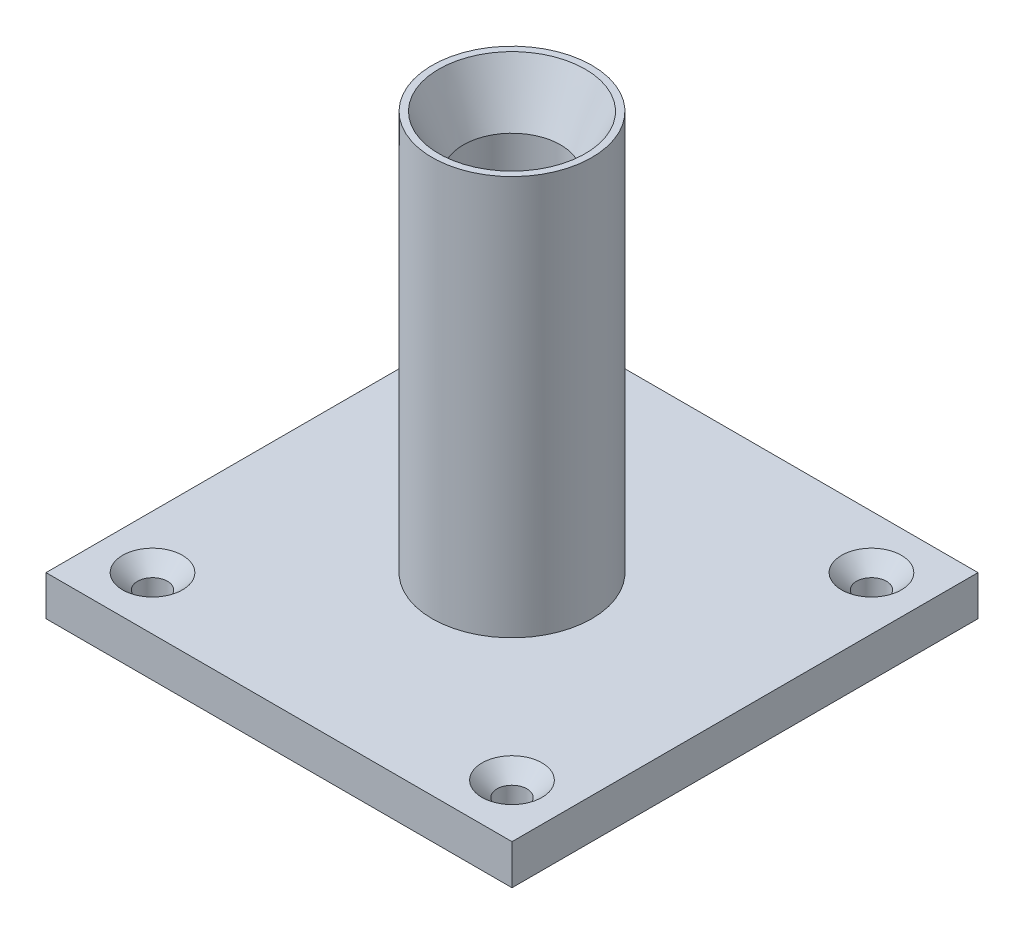
ISO-10303-21;
HEADER;
FILE_DESCRIPTION(('STEP AP214'),'2;1');
FILE_NAME('part.step','',(''),(''),'','','');
FILE_SCHEMA(('AUTOMOTIVE_DESIGN { 1 0 10303 214 1 1 1 1 }'));
ENDSEC;
DATA;
#1=APPLICATION_CONTEXT('core data for automotive mechanical design processes');
#2=APPLICATION_PROTOCOL_DEFINITION('international standard','automotive_design',2000,#1);
#3=PRODUCT_CONTEXT('',#1,'mechanical');
#4=PRODUCT('Part','Part','',(#3));
#5=PRODUCT_RELATED_PRODUCT_CATEGORY('part','',(#4));
#6=PRODUCT_DEFINITION_FORMATION('','',#4);
#7=PRODUCT_DEFINITION_CONTEXT('part definition',#1,'design');
#8=PRODUCT_DEFINITION('design','',#6,#7);
#9=PRODUCT_DEFINITION_SHAPE('','',#8);
#10=(LENGTH_UNIT() NAMED_UNIT(*) SI_UNIT(.MILLI.,.METRE.));
#11=(NAMED_UNIT(*) PLANE_ANGLE_UNIT() SI_UNIT($,.RADIAN.));
#12=(NAMED_UNIT(*) SI_UNIT($,.STERADIAN.) SOLID_ANGLE_UNIT());
#13=UNCERTAINTY_MEASURE_WITH_UNIT(LENGTH_MEASURE(1.E-05),#10,'distance_accuracy_value','');
#14=(GEOMETRIC_REPRESENTATION_CONTEXT(3) GLOBAL_UNCERTAINTY_ASSIGNED_CONTEXT((#13)) GLOBAL_UNIT_ASSIGNED_CONTEXT((#10,
#11,#12)) REPRESENTATION_CONTEXT('',''));
#15=CARTESIAN_POINT('',(0.,0.,0.));
#16=DIRECTION('',(0.,0.,1.));
#17=DIRECTION('',(1.,0.,0.));
#18=AXIS2_PLACEMENT_3D('',#15,#16,#17);
#19=CARTESIAN_POINT('',(0.,0.,0.));
#20=DIRECTION('',(0.,-1.,0.));
#21=DIRECTION('',(0.,0.,-1.));
#22=AXIS2_PLACEMENT_3D('',#19,#20,#21);
#23=CYLINDRICAL_SURFACE('',#22,7.3);
#24=CARTESIAN_POINT('',(0.,58.,0.));
#25=DIRECTION('',(0.,-1.,0.));
#26=DIRECTION('',(0.,0.,-1.));
#27=AXIS2_PLACEMENT_3D('',#24,#25,#26);
#28=CIRCLE('',#27,7.3);
#29=CARTESIAN_POINT('',(6.3,58.,3.68781778291716));
#30=VERTEX_POINT('',#29);
#31=CARTESIAN_POINT('',(6.3,58.,-3.68781778291716));
#32=VERTEX_POINT('',#31);
#33=EDGE_CURVE('E114',#30,#32,#28,.T.);
#34=ORIENTED_EDGE('',*,*,#33,.F.);
#35=DIRECTION('',(0.,-1.,0.));
#36=VECTOR('',#35,1.);
#37=CARTESIAN_POINT('',(6.3,58.,3.68781778291716));
#38=LINE('',#37,#36);
#39=CARTESIAN_POINT('',(6.3,6.,3.68781778291716));
#40=VERTEX_POINT('',#39);
#41=EDGE_CURVE('E103',#30,#40,#38,.T.);
#42=ORIENTED_EDGE('',*,*,#41,.T.);
#43=CARTESIAN_POINT('',(0.,6.,0.));
#44=DIRECTION('',(0.,1.,0.));
#45=DIRECTION('',(0.,0.,1.));
#46=AXIS2_PLACEMENT_3D('',#43,#44,#45);
#47=CIRCLE('',#46,7.3);
#48=CARTESIAN_POINT('',(6.3,6.,-3.68781778291715));
#49=VERTEX_POINT('',#48);
#50=EDGE_CURVE('E119',#40,#49,#47,.F.);
#51=ORIENTED_EDGE('',*,*,#50,.T.);
#52=DIRECTION('',(0.,-1.,0.));
#53=VECTOR('',#52,1.);
#54=CARTESIAN_POINT('',(6.3,58.,-3.68781778291716));
#55=LINE('',#54,#53);
#56=EDGE_CURVE('E53',#32,#49,#55,.T.);
#57=ORIENTED_EDGE('',*,*,#56,.F.);
#58=EDGE_LOOP('',(#34,#42,#51,#57));
#59=FACE_BOUND('',#58,.T.);
#60=ADVANCED_FACE('F37',(#59),#23,.F.);
#61=CARTESIAN_POINT('',(0.,6.,0.));
#62=DIRECTION('',(0.,1.,0.));
#63=DIRECTION('',(0.,0.,1.));
#64=AXIS2_PLACEMENT_3D('',#61,#62,#63);
#65=PLANE('',#64);
#66=ORIENTED_EDGE('',*,*,#50,.F.);
#67=DIRECTION('',(0.,0.,1.));
#68=VECTOR('',#67,1.);
#69=CARTESIAN_POINT('',(6.3,6.,3.68781778291716));
#70=LINE('',#69,#68);
#71=EDGE_CURVE('E106',#49,#40,#70,.T.);
#72=ORIENTED_EDGE('',*,*,#71,.F.);
#73=EDGE_LOOP('',(#66,#72));
#74=FACE_BOUND('',#73,.T.);
#75=ADVANCED_FACE('F193',(#74),#65,.T.);
#76=CARTESIAN_POINT('',(-35.,6.,-35.));
#77=DIRECTION('',(1.,0.,0.));
#78=DIRECTION('',(0.,0.,-1.));
#79=AXIS2_PLACEMENT_3D('',#76,#77,#78);
#80=PLANE('',#79);
#81=DIRECTION('',(0.,0.,1.));
#82=VECTOR('',#81,1.);
#83=CARTESIAN_POINT('',(-35.,0.,-35.));
#84=LINE('',#83,#82);
#85=CARTESIAN_POINT('',(-35.,0.,-35.));
#86=VERTEX_POINT('',#85);
#87=CARTESIAN_POINT('',(-35.,0.,35.));
#88=VERTEX_POINT('',#87);
#89=EDGE_CURVE('E130',#86,#88,#84,.T.);
#90=ORIENTED_EDGE('',*,*,#89,.T.);
#91=DIRECTION('',(0.,-1.,0.));
#92=VECTOR('',#91,1.);
#93=CARTESIAN_POINT('',(-35.,6.,35.));
#94=LINE('',#93,#92);
#95=CARTESIAN_POINT('',(-35.,6.,35.));
#96=VERTEX_POINT('',#95);
#97=EDGE_CURVE('E151',#96,#88,#94,.T.);
#98=ORIENTED_EDGE('',*,*,#97,.F.);
#99=DIRECTION('',(0.,0.,1.));
#100=VECTOR('',#99,1.);
#101=CARTESIAN_POINT('',(-35.,6.,-35.));
#102=LINE('',#101,#100);
#103=CARTESIAN_POINT('',(-35.,6.,-35.));
#104=VERTEX_POINT('',#103);
#105=EDGE_CURVE('E131',#104,#96,#102,.T.);
#106=ORIENTED_EDGE('',*,*,#105,.F.);
#107=DIRECTION('',(0.,-1.,0.));
#108=VECTOR('',#107,1.);
#109=CARTESIAN_POINT('',(-35.,6.,-35.));
#110=LINE('',#109,#108);
#111=EDGE_CURVE('E137',#104,#86,#110,.T.);
#112=ORIENTED_EDGE('',*,*,#111,.T.);
#113=EDGE_LOOP('',(#90,#98,#106,#112));
#114=FACE_BOUND('',#113,.T.);
#115=ADVANCED_FACE('F200',(#114),#80,.F.);
#116=CARTESIAN_POINT('',(-35.,6.,35.));
#117=DIRECTION('',(0.,0.,-1.));
#118=DIRECTION('',(-1.,0.,0.));
#119=AXIS2_PLACEMENT_3D('',#116,#117,#118);
#120=PLANE('',#119);
#121=DIRECTION('',(1.,0.,0.));
#122=VECTOR('',#121,1.);
#123=CARTESIAN_POINT('',(-35.,0.,35.));
#124=LINE('',#123,#122);
#125=CARTESIAN_POINT('',(35.,0.,35.));
#126=VERTEX_POINT('',#125);
#127=EDGE_CURVE('E140',#88,#126,#124,.T.);
#128=ORIENTED_EDGE('',*,*,#127,.T.);
#129=DIRECTION('',(0.,-1.,0.));
#130=VECTOR('',#129,1.);
#131=CARTESIAN_POINT('',(35.,6.,35.));
#132=LINE('',#131,#130);
#133=CARTESIAN_POINT('',(35.,6.,35.));
#134=VERTEX_POINT('',#133);
#135=EDGE_CURVE('E148',#134,#126,#132,.T.);
#136=ORIENTED_EDGE('',*,*,#135,.F.);
#137=DIRECTION('',(1.,0.,0.));
#138=VECTOR('',#137,1.);
#139=CARTESIAN_POINT('',(-35.,6.,35.));
#140=LINE('',#139,#138);
#141=EDGE_CURVE('E91',#96,#134,#140,.T.);
#142=ORIENTED_EDGE('',*,*,#141,.F.);
#143=ORIENTED_EDGE('',*,*,#97,.T.);
#144=EDGE_LOOP('',(#128,#136,#142,#143));
#145=FACE_BOUND('',#144,.T.);
#146=ADVANCED_FACE('F202',(#145),#120,.F.);
#147=CARTESIAN_POINT('',(35.,6.,35.));
#148=DIRECTION('',(-1.,0.,0.));
#149=DIRECTION('',(0.,0.,1.));
#150=AXIS2_PLACEMENT_3D('',#147,#148,#149);
#151=PLANE('',#150);
#152=DIRECTION('',(0.,0.,-1.));
#153=VECTOR('',#152,1.);
#154=CARTESIAN_POINT('',(35.,0.,35.));
#155=LINE('',#154,#153);
#156=CARTESIAN_POINT('',(35.,0.,-35.));
#157=VERTEX_POINT('',#156);
#158=EDGE_CURVE('E142',#126,#157,#155,.T.);
#159=ORIENTED_EDGE('',*,*,#158,.T.);
#160=DIRECTION('',(0.,-1.,0.));
#161=VECTOR('',#160,1.);
#162=CARTESIAN_POINT('',(35.,6.,-35.));
#163=LINE('',#162,#161);
#164=CARTESIAN_POINT('',(35.,6.,-35.));
#165=VERTEX_POINT('',#164);
#166=EDGE_CURVE('E146',#165,#157,#163,.T.);
#167=ORIENTED_EDGE('',*,*,#166,.F.);
#168=DIRECTION('',(0.,0.,-1.));
#169=VECTOR('',#168,1.);
#170=CARTESIAN_POINT('',(35.,6.,35.));
#171=LINE('',#170,#169);
#172=EDGE_CURVE('E134',#134,#165,#171,.T.);
#173=ORIENTED_EDGE('',*,*,#172,.F.);
#174=ORIENTED_EDGE('',*,*,#135,.T.);
#175=EDGE_LOOP('',(#159,#167,#173,#174));
#176=FACE_BOUND('',#175,.T.);
#177=ADVANCED_FACE('F207',(#176),#151,.F.);
#178=CARTESIAN_POINT('',(35.,6.,-35.));
#179=DIRECTION('',(0.,0.,1.));
#180=DIRECTION('',(1.,0.,0.));
#181=AXIS2_PLACEMENT_3D('',#178,#179,#180);
#182=PLANE('',#181);
#183=DIRECTION('',(-1.,0.,0.));
#184=VECTOR('',#183,1.);
#185=CARTESIAN_POINT('',(35.,0.,-35.));
#186=LINE('',#185,#184);
#187=EDGE_CURVE('E83',#157,#86,#186,.T.);
#188=ORIENTED_EDGE('',*,*,#187,.T.);
#189=ORIENTED_EDGE('',*,*,#111,.F.);
#190=DIRECTION('',(-1.,0.,0.));
#191=VECTOR('',#190,1.);
#192=CARTESIAN_POINT('',(35.,6.,-35.));
#193=LINE('',#192,#191);
#194=EDGE_CURVE('E62',#165,#104,#193,.T.);
#195=ORIENTED_EDGE('',*,*,#194,.F.);
#196=ORIENTED_EDGE('',*,*,#166,.T.);
#197=EDGE_LOOP('',(#188,#189,#195,#196));
#198=FACE_BOUND('',#197,.T.);
#199=ADVANCED_FACE('F190',(#198),#182,.F.);
#200=CARTESIAN_POINT('',(27.,6.,-27.));
#201=DIRECTION('',(0.,1.,0.));
#202=DIRECTION('',(0.,0.,1.));
#203=AXIS2_PLACEMENT_3D('',#200,#201,#202);
#204=CIRCLE('',#203,4.49999999999997);
#205=CARTESIAN_POINT('',(27.,6.,-22.5));
#206=VERTEX_POINT('',#205);
#207=EDGE_CURVE('E166',#206,#206,#204,.F.);
#208=ORIENTED_EDGE('',*,*,#207,.T.);
#209=EDGE_LOOP('',(#208));
#210=FACE_BOUND('',#209,.T.);
#211=CARTESIAN_POINT('',(-27.,6.,27.));
#212=DIRECTION('',(0.,1.,0.));
#213=DIRECTION('',(0.,0.,1.));
#214=AXIS2_PLACEMENT_3D('',#211,#212,#213);
#215=CIRCLE('',#214,4.49999999999998);
#216=CARTESIAN_POINT('',(-27.,6.,31.5));
#217=VERTEX_POINT('',#216);
#218=EDGE_CURVE('E163',#217,#217,#215,.F.);
#219=ORIENTED_EDGE('',*,*,#218,.T.);
#220=EDGE_LOOP('',(#219));
#221=FACE_BOUND('',#220,.T.);
#222=CARTESIAN_POINT('',(-27.,6.,-27.));
#223=DIRECTION('',(0.,1.,0.));
#224=DIRECTION('',(0.,0.,1.));
#225=AXIS2_PLACEMENT_3D('',#222,#223,#224);
#226=CIRCLE('',#225,4.49999999999997);
#227=CARTESIAN_POINT('',(-27.,6.,-22.5));
#228=VERTEX_POINT('',#227);
#229=EDGE_CURVE('E160',#228,#228,#226,.F.);
#230=ORIENTED_EDGE('',*,*,#229,.T.);
#231=EDGE_LOOP('',(#230));
#232=FACE_BOUND('',#231,.T.);
#233=CARTESIAN_POINT('',(27.,6.,27.));
#234=DIRECTION('',(0.,1.,0.));
#235=DIRECTION('',(0.,0.,1.));
#236=AXIS2_PLACEMENT_3D('',#233,#234,#235);
#237=CIRCLE('',#236,4.49999999999998);
#238=CARTESIAN_POINT('',(27.,6.,31.5));
#239=VERTEX_POINT('',#238);
#240=EDGE_CURVE('E157',#239,#239,#237,.F.);
#241=ORIENTED_EDGE('',*,*,#240,.T.);
#242=EDGE_LOOP('',(#241));
#243=FACE_BOUND('',#242,.T.);
#244=CARTESIAN_POINT('',(0.,6.,0.));
#245=DIRECTION('',(0.,1.,0.));
#246=DIRECTION('',(0.,0.,1.));
#247=AXIS2_PLACEMENT_3D('',#244,#245,#246);
#248=CIRCLE('',#247,12.);
#249=CARTESIAN_POINT('',(0.,6.,12.));
#250=VERTEX_POINT('',#249);
#251=EDGE_CURVE('E153',#250,#250,#248,.T.);
#252=ORIENTED_EDGE('',*,*,#251,.F.);
#253=EDGE_LOOP('',(#252));
#254=FACE_BOUND('',#253,.T.);
#255=ORIENTED_EDGE('',*,*,#105,.T.);
#256=ORIENTED_EDGE('',*,*,#141,.T.);
#257=ORIENTED_EDGE('',*,*,#172,.T.);
#258=ORIENTED_EDGE('',*,*,#194,.T.);
#259=EDGE_LOOP('',(#255,#256,#257,#258));
#260=FACE_BOUND('',#259,.T.);
#261=ADVANCED_FACE('F186',(#210,#221,#232,#243,#254,#260),#65,.T.);
#262=CARTESIAN_POINT('',(0.,0.,0.));
#263=DIRECTION('',(0.,1.,0.));
#264=DIRECTION('',(0.,0.,1.));
#265=AXIS2_PLACEMENT_3D('',#262,#263,#264);
#266=PLANE('',#265);
#267=CARTESIAN_POINT('',(27.,0.,27.));
#268=DIRECTION('',(0.,1.,0.));
#269=DIRECTION('',(0.,0.,1.));
#270=AXIS2_PLACEMENT_3D('',#267,#268,#269);
#271=CIRCLE('',#270,2.25);
#272=CARTESIAN_POINT('',(27.,0.,29.25));
#273=VERTEX_POINT('',#272);
#274=EDGE_CURVE('E263',#273,#273,#271,.T.);
#275=ORIENTED_EDGE('',*,*,#274,.T.);
#276=EDGE_LOOP('',(#275));
#277=FACE_BOUND('',#276,.T.);
#278=CARTESIAN_POINT('',(-27.,0.,-27.));
#279=DIRECTION('',(0.,1.,0.));
#280=DIRECTION('',(0.,0.,1.));
#281=AXIS2_PLACEMENT_3D('',#278,#279,#280);
#282=CIRCLE('',#281,2.25);
#283=CARTESIAN_POINT('',(-27.,0.,-24.75));
#284=VERTEX_POINT('',#283);
#285=EDGE_CURVE('E260',#284,#284,#282,.T.);
#286=ORIENTED_EDGE('',*,*,#285,.T.);
#287=EDGE_LOOP('',(#286));
#288=FACE_BOUND('',#287,.T.);
#289=CARTESIAN_POINT('',(-27.,0.,27.));
#290=DIRECTION('',(0.,1.,0.));
#291=DIRECTION('',(0.,0.,1.));
#292=AXIS2_PLACEMENT_3D('',#289,#290,#291);
#293=CIRCLE('',#292,2.25);
#294=CARTESIAN_POINT('',(-27.,0.,29.25));
#295=VERTEX_POINT('',#294);
#296=EDGE_CURVE('E258',#295,#295,#293,.T.);
#297=ORIENTED_EDGE('',*,*,#296,.T.);
#298=EDGE_LOOP('',(#297));
#299=FACE_BOUND('',#298,.T.);
#300=CARTESIAN_POINT('',(27.,0.,-27.));
#301=DIRECTION('',(0.,1.,0.));
#302=DIRECTION('',(0.,0.,1.));
#303=AXIS2_PLACEMENT_3D('',#300,#301,#302);
#304=CIRCLE('',#303,2.25);
#305=CARTESIAN_POINT('',(27.,0.,-24.75));
#306=VERTEX_POINT('',#305);
#307=EDGE_CURVE('E266',#306,#306,#304,.T.);
#308=ORIENTED_EDGE('',*,*,#307,.T.);
#309=EDGE_LOOP('',(#308));
#310=FACE_BOUND('',#309,.T.);
#311=ORIENTED_EDGE('',*,*,#89,.F.);
#312=ORIENTED_EDGE('',*,*,#187,.F.);
#313=ORIENTED_EDGE('',*,*,#158,.F.);
#314=ORIENTED_EDGE('',*,*,#127,.F.);
#315=EDGE_LOOP('',(#311,#312,#313,#314));
#316=FACE_BOUND('',#315,.T.);
#317=ADVANCED_FACE('F189',(#277,#288,#299,#310,#316),#266,.F.);
#318=CARTESIAN_POINT('',(0.,0.,0.));
#319=DIRECTION('',(0.,-1.,0.));
#320=DIRECTION('',(0.,0.,-1.));
#321=AXIS2_PLACEMENT_3D('',#318,#319,#320);
#322=CYLINDRICAL_SURFACE('',#321,12.);
#323=CARTESIAN_POINT('',(0.,66.,0.));
#324=DIRECTION('',(0.,-1.,0.));
#325=DIRECTION('',(0.,0.,-1.));
#326=AXIS2_PLACEMENT_3D('',#323,#324,#325);
#327=CIRCLE('',#326,12.);
#328=CARTESIAN_POINT('',(0.,66.,-12.));
#329=VERTEX_POINT('',#328);
#330=EDGE_CURVE('E127',#329,#329,#327,.T.);
#331=ORIENTED_EDGE('',*,*,#330,.T.);
#332=EDGE_LOOP('',(#331));
#333=FACE_BOUND('',#332,.T.);
#334=ORIENTED_EDGE('',*,*,#251,.T.);
#335=EDGE_LOOP('',(#334));
#336=FACE_BOUND('',#335,.T.);
#337=ADVANCED_FACE('F210',(#333,#336),#322,.T.);
#338=CARTESIAN_POINT('',(12.,66.,0.));
#339=DIRECTION('',(0.,1.,0.));
#340=DIRECTION('',(0.,0.,1.));
#341=AXIS2_PLACEMENT_3D('',#338,#339,#340);
#342=PLANE('',#341);
#343=CARTESIAN_POINT('',(0.,66.,0.));
#344=DIRECTION('',(0.,-1.,0.));
#345=DIRECTION('',(0.,0.,-1.));
#346=AXIS2_PLACEMENT_3D('',#343,#344,#345);
#347=CIRCLE('',#346,11.);
#348=CARTESIAN_POINT('',(0.,66.,-11.));
#349=VERTEX_POINT('',#348);
#350=EDGE_CURVE('E113',#349,#349,#347,.T.);
#351=ORIENTED_EDGE('',*,*,#350,.T.);
#352=EDGE_LOOP('',(#351));
#353=FACE_BOUND('',#352,.T.);
#354=ORIENTED_EDGE('',*,*,#330,.F.);
#355=EDGE_LOOP('',(#354));
#356=FACE_BOUND('',#355,.T.);
#357=ADVANCED_FACE('F216',(#353,#356),#342,.T.);
#358=CARTESIAN_POINT('',(0.,66.,0.));
#359=DIRECTION('',(0.,1.,0.));
#360=DIRECTION('',(0.,0.,1.));
#361=AXIS2_PLACEMENT_3D('',#358,#359,#360);
#362=CONICAL_SURFACE('',#361,11.,0.433200168431635);
#363=EDGE_CURVE('E109',#32,#30,#28,.T.);
#364=ORIENTED_EDGE('',*,*,#363,.T.);
#365=ORIENTED_EDGE('',*,*,#33,.T.);
#366=EDGE_LOOP('',(#364,#365));
#367=FACE_BOUND('',#366,.T.);
#368=ORIENTED_EDGE('',*,*,#350,.F.);
#369=EDGE_LOOP('',(#368));
#370=FACE_BOUND('',#369,.T.);
#371=ADVANCED_FACE('F121',(#367,#370),#362,.F.);
#372=CARTESIAN_POINT('',(6.3,58.,3.68781778291716));
#373=DIRECTION('',(1.,0.,0.));
#374=DIRECTION('',(0.,0.,-1.));
#375=AXIS2_PLACEMENT_3D('',#372,#373,#374);
#376=PLANE('',#375);
#377=ORIENTED_EDGE('',*,*,#71,.T.);
#378=ORIENTED_EDGE('',*,*,#41,.F.);
#379=DIRECTION('',(0.,0.,1.));
#380=VECTOR('',#379,1.);
#381=CARTESIAN_POINT('',(6.3,58.,3.68781778291716));
#382=LINE('',#381,#380);
#383=EDGE_CURVE('E99',#32,#30,#382,.T.);
#384=ORIENTED_EDGE('',*,*,#383,.F.);
#385=ORIENTED_EDGE('',*,*,#56,.T.);
#386=EDGE_LOOP('',(#377,#378,#384,#385));
#387=FACE_BOUND('',#386,.T.);
#388=ADVANCED_FACE('F101',(#387),#376,.F.);
#389=CARTESIAN_POINT('',(0.,58.,0.));
#390=DIRECTION('',(0.,1.,0.));
#391=DIRECTION('',(0.,0.,1.));
#392=AXIS2_PLACEMENT_3D('',#389,#390,#391);
#393=PLANE('',#392);
#394=ORIENTED_EDGE('',*,*,#363,.F.);
#395=ORIENTED_EDGE('',*,*,#383,.T.);
#396=EDGE_LOOP('',(#394,#395));
#397=FACE_BOUND('',#396,.T.);
#398=ADVANCED_FACE('F110',(#397),#393,.T.);
#399=CARTESIAN_POINT('',(27.,66.,-27.));
#400=DIRECTION('',(0.,-1.,0.));
#401=DIRECTION('',(0.,0.,-1.));
#402=AXIS2_PLACEMENT_3D('',#399,#400,#401);
#403=CYLINDRICAL_SURFACE('',#402,2.25);
#404=CARTESIAN_POINT('',(27.,3.75000000000001,-27.));
#405=DIRECTION('',(0.,1.,0.));
#406=DIRECTION('',(0.,0.,1.));
#407=AXIS2_PLACEMENT_3D('',#404,#405,#406);
#408=CIRCLE('',#407,2.25);
#409=CARTESIAN_POINT('',(27.,3.75000000000001,-24.75));
#410=VERTEX_POINT('',#409);
#411=EDGE_CURVE('E169',#410,#410,#408,.T.);
#412=ORIENTED_EDGE('',*,*,#411,.T.);
#413=EDGE_LOOP('',(#412));
#414=FACE_BOUND('',#413,.T.);
#415=ORIENTED_EDGE('',*,*,#307,.F.);
#416=EDGE_LOOP('',(#415));
#417=FACE_BOUND('',#416,.T.);
#418=ADVANCED_FACE('F238',(#414,#417),#403,.F.);
#419=CARTESIAN_POINT('',(-27.,66.,27.));
#420=DIRECTION('',(0.,-1.,0.));
#421=DIRECTION('',(0.,0.,-1.));
#422=AXIS2_PLACEMENT_3D('',#419,#420,#421);
#423=CYLINDRICAL_SURFACE('',#422,2.25);
#424=CARTESIAN_POINT('',(-27.,3.75000000000001,27.));
#425=DIRECTION('',(0.,1.,0.));
#426=DIRECTION('',(0.,0.,1.));
#427=AXIS2_PLACEMENT_3D('',#424,#425,#426);
#428=CIRCLE('',#427,2.25);
#429=CARTESIAN_POINT('',(-27.,3.75000000000001,29.25));
#430=VERTEX_POINT('',#429);
#431=EDGE_CURVE('E172',#430,#430,#428,.T.);
#432=ORIENTED_EDGE('',*,*,#431,.T.);
#433=EDGE_LOOP('',(#432));
#434=FACE_BOUND('',#433,.T.);
#435=ORIENTED_EDGE('',*,*,#296,.F.);
#436=EDGE_LOOP('',(#435));
#437=FACE_BOUND('',#436,.T.);
#438=ADVANCED_FACE('F241',(#434,#437),#423,.F.);
#439=CARTESIAN_POINT('',(-27.,66.,-27.));
#440=DIRECTION('',(0.,-1.,0.));
#441=DIRECTION('',(0.,0.,-1.));
#442=AXIS2_PLACEMENT_3D('',#439,#440,#441);
#443=CYLINDRICAL_SURFACE('',#442,2.25);
#444=CARTESIAN_POINT('',(-27.,3.75000000000001,-27.));
#445=DIRECTION('',(0.,1.,0.));
#446=DIRECTION('',(0.,0.,1.));
#447=AXIS2_PLACEMENT_3D('',#444,#445,#446);
#448=CIRCLE('',#447,2.25);
#449=CARTESIAN_POINT('',(-27.,3.75000000000001,-24.75));
#450=VERTEX_POINT('',#449);
#451=EDGE_CURVE('E46',#450,#450,#448,.T.);
#452=ORIENTED_EDGE('',*,*,#451,.T.);
#453=EDGE_LOOP('',(#452));
#454=FACE_BOUND('',#453,.T.);
#455=ORIENTED_EDGE('',*,*,#285,.F.);
#456=EDGE_LOOP('',(#455));
#457=FACE_BOUND('',#456,.T.);
#458=ADVANCED_FACE('F177',(#454,#457),#443,.F.);
#459=CARTESIAN_POINT('',(27.,66.,27.));
#460=DIRECTION('',(0.,-1.,0.));
#461=DIRECTION('',(0.,0.,-1.));
#462=AXIS2_PLACEMENT_3D('',#459,#460,#461);
#463=CYLINDRICAL_SURFACE('',#462,2.25);
#464=CARTESIAN_POINT('',(27.,3.75000000000001,27.));
#465=DIRECTION('',(0.,1.,0.));
#466=DIRECTION('',(0.,0.,1.));
#467=AXIS2_PLACEMENT_3D('',#464,#465,#466);
#468=CIRCLE('',#467,2.25);
#469=CARTESIAN_POINT('',(27.,3.75000000000001,29.25));
#470=VERTEX_POINT('',#469);
#471=EDGE_CURVE('E11',#470,#470,#468,.T.);
#472=ORIENTED_EDGE('',*,*,#471,.T.);
#473=EDGE_LOOP('',(#472));
#474=FACE_BOUND('',#473,.T.);
#475=ORIENTED_EDGE('',*,*,#274,.F.);
#476=EDGE_LOOP('',(#475));
#477=FACE_BOUND('',#476,.T.);
#478=ADVANCED_FACE('F245',(#474,#477),#463,.F.);
#479=CARTESIAN_POINT('',(27.,6.,-27.));
#480=DIRECTION('',(0.,1.,0.));
#481=DIRECTION('',(0.,0.,1.));
#482=AXIS2_PLACEMENT_3D('',#479,#480,#481);
#483=CONICAL_SURFACE('',#482,4.49999999999997,0.785398163397445);
#484=ORIENTED_EDGE('',*,*,#411,.F.);
#485=EDGE_LOOP('',(#484));
#486=FACE_BOUND('',#485,.T.);
#487=ORIENTED_EDGE('',*,*,#207,.F.);
#488=EDGE_LOOP('',(#487));
#489=FACE_BOUND('',#488,.T.);
#490=ADVANCED_FACE('F248',(#486,#489),#483,.F.);
#491=CARTESIAN_POINT('',(-27.,6.,27.));
#492=DIRECTION('',(0.,1.,0.));
#493=DIRECTION('',(0.,0.,1.));
#494=AXIS2_PLACEMENT_3D('',#491,#492,#493);
#495=CONICAL_SURFACE('',#494,4.49999999999998,0.785398163397446);
#496=ORIENTED_EDGE('',*,*,#431,.F.);
#497=EDGE_LOOP('',(#496));
#498=FACE_BOUND('',#497,.T.);
#499=ORIENTED_EDGE('',*,*,#218,.F.);
#500=EDGE_LOOP('',(#499));
#501=FACE_BOUND('',#500,.T.);
#502=ADVANCED_FACE('F183',(#498,#501),#495,.F.);
#503=CARTESIAN_POINT('',(-27.,6.,-27.));
#504=DIRECTION('',(0.,1.,0.));
#505=DIRECTION('',(0.,0.,1.));
#506=AXIS2_PLACEMENT_3D('',#503,#504,#505);
#507=CONICAL_SURFACE('',#506,4.49999999999997,0.785398163397445);
#508=ORIENTED_EDGE('',*,*,#451,.F.);
#509=EDGE_LOOP('',(#508));
#510=FACE_BOUND('',#509,.T.);
#511=ORIENTED_EDGE('',*,*,#229,.F.);
#512=EDGE_LOOP('',(#511));
#513=FACE_BOUND('',#512,.T.);
#514=ADVANCED_FACE('F180',(#510,#513),#507,.F.);
#515=CARTESIAN_POINT('',(27.,6.,27.));
#516=DIRECTION('',(0.,1.,0.));
#517=DIRECTION('',(0.,0.,1.));
#518=AXIS2_PLACEMENT_3D('',#515,#516,#517);
#519=CONICAL_SURFACE('',#518,4.49999999999998,0.785398163397446);
#520=ORIENTED_EDGE('',*,*,#471,.F.);
#521=EDGE_LOOP('',(#520));
#522=FACE_BOUND('',#521,.T.);
#523=ORIENTED_EDGE('',*,*,#240,.F.);
#524=EDGE_LOOP('',(#523));
#525=FACE_BOUND('',#524,.T.);
#526=ADVANCED_FACE('F40',(#522,#525),#519,.F.);
#527=CLOSED_SHELL('',(#60,#75,#115,#146,#177,#199,#261,#317,#337,#357,#371,#388,#398,#418,#438,
#458,#478,#490,#502,#514,#526));
#528=MANIFOLD_SOLID_BREP('B2',#527);
#529=ADVANCED_BREP_SHAPE_REPRESENTATION('',(#18,#528),#14);
#530=SHAPE_DEFINITION_REPRESENTATION(#9,#529);
ENDSEC;
END-ISO-10303-21;
